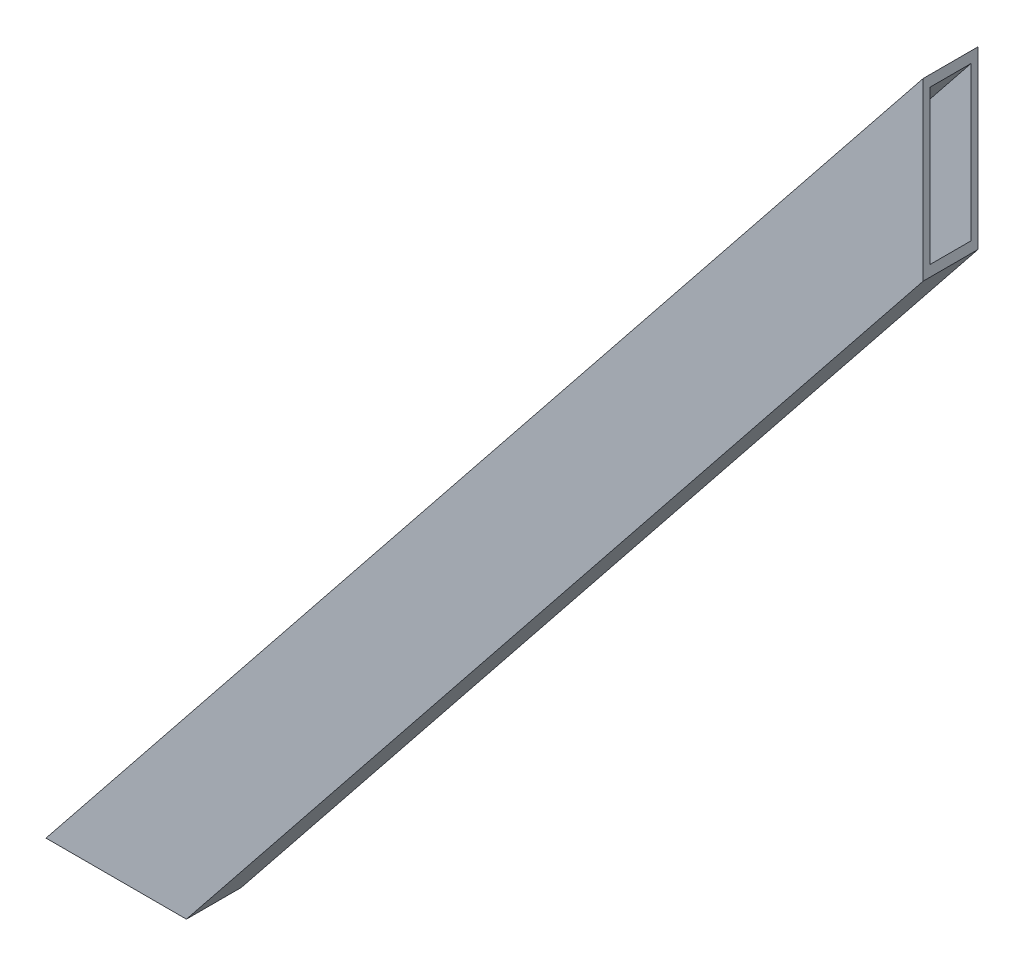
ISO-10303-21;
HEADER;
FILE_DESCRIPTION(('STEP AP214'),'2;1');
FILE_NAME('part.step','',(''),(''),'','','');
FILE_SCHEMA(('AUTOMOTIVE_DESIGN { 1 0 10303 214 1 1 1 1 }'));
ENDSEC;
DATA;
#1=APPLICATION_CONTEXT('core data for automotive mechanical design processes');
#2=APPLICATION_PROTOCOL_DEFINITION('international standard','automotive_design',2000,#1);
#3=PRODUCT_CONTEXT('',#1,'mechanical');
#4=PRODUCT('Part','Part','',(#3));
#5=PRODUCT_RELATED_PRODUCT_CATEGORY('part','',(#4));
#6=PRODUCT_DEFINITION_FORMATION('','',#4);
#7=PRODUCT_DEFINITION_CONTEXT('part definition',#1,'design');
#8=PRODUCT_DEFINITION('design','',#6,#7);
#9=PRODUCT_DEFINITION_SHAPE('','',#8);
#10=(LENGTH_UNIT() NAMED_UNIT(*) SI_UNIT(.MILLI.,.METRE.));
#11=(NAMED_UNIT(*) PLANE_ANGLE_UNIT() SI_UNIT($,.RADIAN.));
#12=(NAMED_UNIT(*) SI_UNIT($,.STERADIAN.) SOLID_ANGLE_UNIT());
#13=UNCERTAINTY_MEASURE_WITH_UNIT(LENGTH_MEASURE(1.E-05),#10,'distance_accuracy_value','');
#14=(GEOMETRIC_REPRESENTATION_CONTEXT(3) GLOBAL_UNCERTAINTY_ASSIGNED_CONTEXT((#13)) GLOBAL_UNIT_ASSIGNED_CONTEXT((#10,
#11,#12)) REPRESENTATION_CONTEXT('',''));
#15=CARTESIAN_POINT('',(0.,0.,0.));
#16=DIRECTION('',(0.,0.,1.));
#17=DIRECTION('',(1.,0.,0.));
#18=AXIS2_PLACEMENT_3D('',#15,#16,#17);
#19=CARTESIAN_POINT('',(65.0557422523179,0.,25.4));
#20=DIRECTION('',(0.,1.,0.));
#21=DIRECTION('',(-1.,0.,0.));
#22=AXIS2_PLACEMENT_3D('',#19,#20,#21);
#23=PLANE('',#22);
#24=DIRECTION('',(1.,0.,0.));
#25=VECTOR('',#24,1.);
#26=CARTESIAN_POINT('',(65.0557422523179,0.,0.));
#27=LINE('',#26,#25);
#28=CARTESIAN_POINT('',(0.,0.,0.));
#29=VERTEX_POINT('',#28);
#30=CARTESIAN_POINT('',(65.0557422523179,0.,0.));
#31=VERTEX_POINT('',#30);
#32=EDGE_CURVE('E184',#29,#31,#27,.T.);
#33=ORIENTED_EDGE('',*,*,#32,.T.);
#34=DIRECTION('',(0.,0.,-1.));
#35=VECTOR('',#34,1.);
#36=CARTESIAN_POINT('',(65.0557422523179,0.,25.4));
#37=LINE('',#36,#35);
#38=CARTESIAN_POINT('',(65.0557422523179,0.,25.4));
#39=VERTEX_POINT('',#38);
#40=EDGE_CURVE('E217',#39,#31,#37,.T.);
#41=ORIENTED_EDGE('',*,*,#40,.F.);
#42=DIRECTION('',(1.,0.,0.));
#43=VECTOR('',#42,1.);
#44=CARTESIAN_POINT('',(65.0557422523179,0.,25.4));
#45=LINE('',#44,#43);
#46=CARTESIAN_POINT('',(0.,0.,25.4));
#47=VERTEX_POINT('',#46);
#48=EDGE_CURVE('E191',#47,#39,#45,.T.);
#49=ORIENTED_EDGE('',*,*,#48,.F.);
#50=DIRECTION('',(0.,0.,-1.));
#51=VECTOR('',#50,1.);
#52=CARTESIAN_POINT('',(0.,0.,25.4));
#53=LINE('',#52,#51);
#54=EDGE_CURVE('E201',#47,#29,#53,.T.);
#55=ORIENTED_EDGE('',*,*,#54,.T.);
#56=EDGE_LOOP('',(#33,#41,#49,#55));
#57=FACE_BOUND('',#56,.T.);
#58=DIRECTION('',(1.,0.,0.));
#59=VECTOR('',#58,1.);
#60=CARTESIAN_POINT('',(65.0557422523179,0.,3.175));
#61=LINE('',#60,#59);
#62=CARTESIAN_POINT('',(4.06598389076986,0.,3.175));
#63=VERTEX_POINT('',#62);
#64=CARTESIAN_POINT('',(60.989758361548,0.,3.175));
#65=VERTEX_POINT('',#64);
#66=EDGE_CURVE('E156',#63,#65,#61,.T.);
#67=ORIENTED_EDGE('',*,*,#66,.F.);
#68=DIRECTION('',(0.,0.,-1.));
#69=VECTOR('',#68,1.);
#70=CARTESIAN_POINT('',(4.06598389076986,0.,25.4));
#71=LINE('',#70,#69);
#72=CARTESIAN_POINT('',(4.06598389076986,0.,22.225));
#73=VERTEX_POINT('',#72);
#74=EDGE_CURVE('E179',#73,#63,#71,.T.);
#75=ORIENTED_EDGE('',*,*,#74,.F.);
#76=DIRECTION('',(1.,0.,0.));
#77=VECTOR('',#76,1.);
#78=CARTESIAN_POINT('',(65.0557422523179,0.,22.225));
#79=LINE('',#78,#77);
#80=CARTESIAN_POINT('',(60.989758361548,0.,22.225));
#81=VERTEX_POINT('',#80);
#82=EDGE_CURVE('E175',#73,#81,#79,.T.);
#83=ORIENTED_EDGE('',*,*,#82,.T.);
#84=DIRECTION('',(0.,0.,-1.));
#85=VECTOR('',#84,1.);
#86=CARTESIAN_POINT('',(60.989758361548,0.,25.4));
#87=LINE('',#86,#85);
#88=EDGE_CURVE('E168',#81,#65,#87,.T.);
#89=ORIENTED_EDGE('',*,*,#88,.T.);
#90=EDGE_LOOP('',(#67,#75,#83,#89));
#91=FACE_BOUND('',#90,.T.);
#92=ADVANCED_FACE('F37',(#57,#91),#23,.F.);
#93=CARTESIAN_POINT('',(406.4,508.,25.4));
#94=DIRECTION('',(-1.,0.,0.));
#95=DIRECTION('',(0.,0.,1.));
#96=AXIS2_PLACEMENT_3D('',#93,#94,#95);
#97=PLANE('',#96);
#98=DIRECTION('',(0.,1.,0.));
#99=VECTOR('',#98,1.);
#100=CARTESIAN_POINT('',(406.4,508.,0.));
#101=LINE('',#100,#99);
#102=CARTESIAN_POINT('',(406.4,426.680322184603,0.));
#103=VERTEX_POINT('',#102);
#104=CARTESIAN_POINT('',(406.4,508.,0.));
#105=VERTEX_POINT('',#104);
#106=EDGE_CURVE('E206',#103,#105,#101,.T.);
#107=ORIENTED_EDGE('',*,*,#106,.T.);
#108=DIRECTION('',(0.,0.,-1.));
#109=VECTOR('',#108,1.);
#110=CARTESIAN_POINT('',(406.4,508.,25.4));
#111=LINE('',#110,#109);
#112=CARTESIAN_POINT('',(406.4,508.,25.4));
#113=VERTEX_POINT('',#112);
#114=EDGE_CURVE('E211',#113,#105,#111,.T.);
#115=ORIENTED_EDGE('',*,*,#114,.F.);
#116=DIRECTION('',(0.,1.,0.));
#117=VECTOR('',#116,1.);
#118=CARTESIAN_POINT('',(406.4,508.,25.4));
#119=LINE('',#118,#117);
#120=CARTESIAN_POINT('',(406.4,426.680322184603,25.4));
#121=VERTEX_POINT('',#120);
#122=EDGE_CURVE('E197',#121,#113,#119,.T.);
#123=ORIENTED_EDGE('',*,*,#122,.F.);
#124=DIRECTION('',(0.,0.,-1.));
#125=VECTOR('',#124,1.);
#126=CARTESIAN_POINT('',(406.4,426.680322184603,25.4));
#127=LINE('',#126,#125);
#128=EDGE_CURVE('E214',#121,#103,#127,.T.);
#129=ORIENTED_EDGE('',*,*,#128,.T.);
#130=EDGE_LOOP('',(#107,#115,#123,#129));
#131=FACE_BOUND('',#130,.T.);
#132=DIRECTION('',(0.,1.,0.));
#133=VECTOR('',#132,1.);
#134=CARTESIAN_POINT('',(406.4,508.,3.175));
#135=LINE('',#134,#133);
#136=CARTESIAN_POINT('',(406.4,431.762802048065,3.175));
#137=VERTEX_POINT('',#136);
#138=CARTESIAN_POINT('',(406.4,502.917520136538,3.175));
#139=VERTEX_POINT('',#138);
#140=EDGE_CURVE('E153',#137,#139,#135,.T.);
#141=ORIENTED_EDGE('',*,*,#140,.F.);
#142=DIRECTION('',(0.,0.,-1.));
#143=VECTOR('',#142,1.);
#144=CARTESIAN_POINT('',(406.4,431.762802048065,25.4));
#145=LINE('',#144,#143);
#146=CARTESIAN_POINT('',(406.4,431.762802048065,22.225));
#147=VERTEX_POINT('',#146);
#148=EDGE_CURVE('E163',#147,#137,#145,.T.);
#149=ORIENTED_EDGE('',*,*,#148,.F.);
#150=DIRECTION('',(0.,1.,0.));
#151=VECTOR('',#150,1.);
#152=CARTESIAN_POINT('',(406.4,508.,22.225));
#153=LINE('',#152,#151);
#154=CARTESIAN_POINT('',(406.4,502.917520136538,22.225));
#155=VERTEX_POINT('',#154);
#156=EDGE_CURVE('E180',#147,#155,#153,.T.);
#157=ORIENTED_EDGE('',*,*,#156,.T.);
#158=DIRECTION('',(0.,0.,-1.));
#159=VECTOR('',#158,1.);
#160=CARTESIAN_POINT('',(406.4,502.917520136538,25.4));
#161=LINE('',#160,#159);
#162=EDGE_CURVE('E169',#155,#139,#161,.T.);
#163=ORIENTED_EDGE('',*,*,#162,.T.);
#164=EDGE_LOOP('',(#141,#149,#157,#163));
#165=FACE_BOUND('',#164,.T.);
#166=ADVANCED_FACE('F172',(#131,#165),#97,.F.);
#167=CARTESIAN_POINT('',(406.4,426.680322184603,25.4));
#168=DIRECTION('',(-0.78086880944303,0.624695047554424,0.));
#169=DIRECTION('',(-0.624695047554424,-0.780868809443031,0.));
#170=AXIS2_PLACEMENT_3D('',#167,#168,#169);
#171=PLANE('',#170);
#172=DIRECTION('',(0.624695047554424,0.78086880944303,0.));
#173=VECTOR('',#172,1.);
#174=CARTESIAN_POINT('',(406.4,426.680322184603,0.));
#175=LINE('',#174,#173);
#176=EDGE_CURVE('E204',#31,#103,#175,.T.);
#177=ORIENTED_EDGE('',*,*,#176,.T.);
#178=ORIENTED_EDGE('',*,*,#128,.F.);
#179=DIRECTION('',(0.624695047554424,0.78086880944303,0.));
#180=VECTOR('',#179,1.);
#181=CARTESIAN_POINT('',(406.4,426.680322184603,25.4));
#182=LINE('',#181,#180);
#183=EDGE_CURVE('E194',#39,#121,#182,.T.);
#184=ORIENTED_EDGE('',*,*,#183,.F.);
#185=ORIENTED_EDGE('',*,*,#40,.T.);
#186=EDGE_LOOP('',(#177,#178,#184,#185));
#187=FACE_BOUND('',#186,.T.);
#188=ADVANCED_FACE('F356',(#187),#171,.F.);
#189=CARTESIAN_POINT('',(0.,0.,25.4));
#190=DIRECTION('',(0.78086880944303,-0.624695047554424,0.));
#191=DIRECTION('',(0.624695047554424,0.780868809443031,0.));
#192=AXIS2_PLACEMENT_3D('',#189,#190,#191);
#193=PLANE('',#192);
#194=DIRECTION('',(-0.624695047554424,-0.78086880944303,0.));
#195=VECTOR('',#194,1.);
#196=CARTESIAN_POINT('',(0.,0.,0.));
#197=LINE('',#196,#195);
#198=EDGE_CURVE('E195',#105,#29,#197,.T.);
#199=ORIENTED_EDGE('',*,*,#198,.T.);
#200=ORIENTED_EDGE('',*,*,#54,.F.);
#201=DIRECTION('',(-0.624695047554424,-0.78086880944303,0.));
#202=VECTOR('',#201,1.);
#203=CARTESIAN_POINT('',(0.,0.,25.4));
#204=LINE('',#203,#202);
#205=EDGE_CURVE('E199',#113,#47,#204,.T.);
#206=ORIENTED_EDGE('',*,*,#205,.F.);
#207=ORIENTED_EDGE('',*,*,#114,.T.);
#208=EDGE_LOOP('',(#199,#200,#206,#207));
#209=FACE_BOUND('',#208,.T.);
#210=ADVANCED_FACE('F414',(#209),#193,.F.);
#211=CARTESIAN_POINT('',(0.,0.,25.4));
#212=DIRECTION('',(0.,0.,1.));
#213=DIRECTION('',(1.,0.,0.));
#214=AXIS2_PLACEMENT_3D('',#211,#212,#213);
#215=PLANE('',#214);
#216=ORIENTED_EDGE('',*,*,#48,.T.);
#217=ORIENTED_EDGE('',*,*,#183,.T.);
#218=ORIENTED_EDGE('',*,*,#122,.T.);
#219=ORIENTED_EDGE('',*,*,#205,.T.);
#220=EDGE_LOOP('',(#216,#217,#218,#219));
#221=FACE_BOUND('',#220,.T.);
#222=ADVANCED_FACE('F408',(#221),#215,.T.);
#223=CARTESIAN_POINT('',(0.,0.,0.));
#224=DIRECTION('',(0.,0.,1.));
#225=DIRECTION('',(1.,0.,0.));
#226=AXIS2_PLACEMENT_3D('',#223,#224,#225);
#227=PLANE('',#226);
#228=CARTESIAN_POINT('',(296.519313009802,299.49442317378,0.));
#229=DIRECTION('',(0.,0.,1.));
#230=DIRECTION('',(1.,0.,0.));
#231=AXIS2_PLACEMENT_3D('',#228,#229,#230);
#232=CIRCLE('',#231,2.38125000000007);
#233=CARTESIAN_POINT('',(298.900563009802,299.49442317378,0.));
#234=VERTEX_POINT('',#233);
#235=EDGE_CURVE('E734',#234,#234,#232,.T.);
#236=ORIENTED_EDGE('',*,*,#235,.T.);
#237=EDGE_LOOP('',(#236));
#238=FACE_BOUND('',#237,.T.);
#239=CARTESIAN_POINT('',(344.121075633449,358.996626453339,0.));
#240=DIRECTION('',(0.,0.,1.));
#241=DIRECTION('',(1.,0.,0.));
#242=AXIS2_PLACEMENT_3D('',#239,#240,#241);
#243=CIRCLE('',#242,2.38125000000001);
#244=CARTESIAN_POINT('',(346.502325633449,358.996626453339,0.));
#245=VERTEX_POINT('',#244);
#246=EDGE_CURVE('E735',#245,#245,#243,.T.);
#247=ORIENTED_EDGE('',*,*,#246,.T.);
#248=EDGE_LOOP('',(#247));
#249=FACE_BOUND('',#248,.T.);
#250=CARTESIAN_POINT('',(98.1786354112725,51.5685761756177,0.));
#251=DIRECTION('',(0.,0.,1.));
#252=DIRECTION('',(-1.,0.,0.));
#253=AXIS2_PLACEMENT_3D('',#250,#251,#252);
#254=CIRCLE('',#253,2.38125);
#255=CARTESIAN_POINT('',(95.7973854112725,51.5685761756177,0.));
#256=VERTEX_POINT('',#255);
#257=EDGE_CURVE('E739',#256,#256,#254,.T.);
#258=ORIENTED_EDGE('',*,*,#257,.T.);
#259=EDGE_LOOP('',(#258));
#260=FACE_BOUND('',#259,.T.);
#261=CARTESIAN_POINT('',(145.78039803492,111.070779455177,0.));
#262=DIRECTION('',(0.,0.,1.));
#263=DIRECTION('',(-1.,0.,0.));
#264=AXIS2_PLACEMENT_3D('',#261,#262,#263);
#265=CIRCLE('',#264,2.38125);
#266=CARTESIAN_POINT('',(143.39914803492,111.070779455177,0.));
#267=VERTEX_POINT('',#266);
#268=EDGE_CURVE('E752',#267,#267,#265,.T.);
#269=ORIENTED_EDGE('',*,*,#268,.T.);
#270=EDGE_LOOP('',(#269));
#271=FACE_BOUND('',#270,.T.);
#272=CARTESIAN_POINT('',(193.382160658567,170.572982734736,0.));
#273=DIRECTION('',(0.,0.,1.));
#274=DIRECTION('',(-1.,0.,0.));
#275=AXIS2_PLACEMENT_3D('',#272,#273,#274);
#276=CIRCLE('',#275,2.38124999999995);
#277=CARTESIAN_POINT('',(191.000910658567,170.572982734736,0.));
#278=VERTEX_POINT('',#277);
#279=EDGE_CURVE('E326',#278,#278,#276,.T.);
#280=ORIENTED_EDGE('',*,*,#279,.T.);
#281=EDGE_LOOP('',(#280));
#282=FACE_BOUND('',#281,.T.);
#283=CARTESIAN_POINT('',(163.631059018787,194.373864046559,0.));
#284=DIRECTION('',(0.,0.,1.));
#285=DIRECTION('',(1.,0.,0.));
#286=AXIS2_PLACEMENT_3D('',#283,#284,#285);
#287=CIRCLE('',#286,2.38124999999998);
#288=CARTESIAN_POINT('',(166.012309018787,194.373864046559,0.));
#289=VERTEX_POINT('',#288);
#290=EDGE_CURVE('E747',#289,#289,#287,.T.);
#291=ORIENTED_EDGE('',*,*,#290,.T.);
#292=EDGE_LOOP('',(#291));
#293=FACE_BOUND('',#292,.T.);
#294=CARTESIAN_POINT('',(116.02929639514,134.871660767,0.));
#295=DIRECTION('',(0.,0.,1.));
#296=DIRECTION('',(1.,0.,0.));
#297=AXIS2_PLACEMENT_3D('',#294,#295,#296);
#298=CIRCLE('',#297,2.38125);
#299=CARTESIAN_POINT('',(118.41054639514,134.871660767,0.));
#300=VERTEX_POINT('',#299);
#301=EDGE_CURVE('E323',#300,#300,#298,.T.);
#302=ORIENTED_EDGE('',*,*,#301,.T.);
#303=EDGE_LOOP('',(#302));
#304=FACE_BOUND('',#303,.T.);
#305=CARTESIAN_POINT('',(68.4275337714929,75.3694574874414,0.));
#306=DIRECTION('',(0.,0.,1.));
#307=DIRECTION('',(1.,0.,0.));
#308=AXIS2_PLACEMENT_3D('',#305,#306,#307);
#309=CIRCLE('',#308,2.38125);
#310=CARTESIAN_POINT('',(70.8087837714929,75.3694574874414,0.));
#311=VERTEX_POINT('',#310);
#312=EDGE_CURVE('E317',#311,#311,#309,.T.);
#313=ORIENTED_EDGE('',*,*,#312,.T.);
#314=EDGE_LOOP('',(#313));
#315=FACE_BOUND('',#314,.T.);
#316=CARTESIAN_POINT('',(248.917550386155,239.992219894221,0.));
#317=DIRECTION('',(0.,0.,1.));
#318=DIRECTION('',(1.,0.,0.));
#319=AXIS2_PLACEMENT_3D('',#316,#317,#318);
#320=CIRCLE('',#319,2.38124999999986);
#321=CARTESIAN_POINT('',(251.298800386155,239.992219894221,0.));
#322=VERTEX_POINT('',#321);
#323=EDGE_CURVE('E736',#322,#322,#320,.T.);
#324=ORIENTED_EDGE('',*,*,#323,.T.);
#325=EDGE_LOOP('',(#324));
#326=FACE_BOUND('',#325,.T.);
#327=CARTESIAN_POINT('',(219.166448746375,263.793101206044,0.));
#328=DIRECTION('',(0.,0.,1.));
#329=DIRECTION('',(-1.,0.,0.));
#330=AXIS2_PLACEMENT_3D('',#327,#328,#329);
#331=CIRCLE('',#330,2.38124999999994);
#332=CARTESIAN_POINT('',(216.785198746375,263.793101206044,0.));
#333=VERTEX_POINT('',#332);
#334=EDGE_CURVE('E742',#333,#333,#331,.T.);
#335=ORIENTED_EDGE('',*,*,#334,.T.);
#336=EDGE_LOOP('',(#335));
#337=FACE_BOUND('',#336,.T.);
#338=CARTESIAN_POINT('',(266.768211370022,323.295304485603,0.));
#339=DIRECTION('',(0.,0.,1.));
#340=DIRECTION('',(-1.,0.,0.));
#341=AXIS2_PLACEMENT_3D('',#338,#339,#340);
#342=CIRCLE('',#341,2.38125000000001);
#343=CARTESIAN_POINT('',(264.386961370022,323.295304485603,0.));
#344=VERTEX_POINT('',#343);
#345=EDGE_CURVE('E770',#344,#344,#342,.T.);
#346=ORIENTED_EDGE('',*,*,#345,.T.);
#347=EDGE_LOOP('',(#346));
#348=FACE_BOUND('',#347,.T.);
#349=CARTESIAN_POINT('',(314.369973993669,382.797507765162,0.));
#350=DIRECTION('',(0.,0.,1.));
#351=DIRECTION('',(-1.,0.,0.));
#352=AXIS2_PLACEMENT_3D('',#349,#350,#351);
#353=CIRCLE('',#352,2.38125000000001);
#354=CARTESIAN_POINT('',(311.988723993669,382.797507765162,0.));
#355=VERTEX_POINT('',#354);
#356=EDGE_CURVE('E767',#355,#355,#353,.T.);
#357=ORIENTED_EDGE('',*,*,#356,.T.);
#358=EDGE_LOOP('',(#357));
#359=FACE_BOUND('',#358,.T.);
#360=CARTESIAN_POINT('',(191.398753882581,229.083482626302,0.));
#361=DIRECTION('',(0.,0.,1.));
#362=DIRECTION('',(1.,0.,0.));
#363=AXIS2_PLACEMENT_3D('',#360,#361,#362);
#364=CIRCLE('',#363,2.38125);
#365=CARTESIAN_POINT('',(193.780003882581,229.083482626302,0.));
#366=VERTEX_POINT('',#365);
#367=EDGE_CURVE('E764',#366,#366,#364,.T.);
#368=ORIENTED_EDGE('',*,*,#367,.T.);
#369=EDGE_LOOP('',(#368));
#370=FACE_BOUND('',#369,.T.);
#371=CARTESIAN_POINT('',(221.149855522361,205.282601314478,0.));
#372=DIRECTION('',(0.,0.,1.));
#373=DIRECTION('',(1.,0.,0.));
#374=AXIS2_PLACEMENT_3D('',#371,#372,#373);
#375=CIRCLE('',#374,2.38125);
#376=CARTESIAN_POINT('',(223.531105522361,205.282601314478,0.));
#377=VERTEX_POINT('',#376);
#378=EDGE_CURVE('E761',#377,#377,#375,.T.);
#379=ORIENTED_EDGE('',*,*,#378,.T.);
#380=EDGE_LOOP('',(#379));
#381=FACE_BOUND('',#380,.T.);
#382=DIRECTION('',(-0.780868809443031,0.624695047554424,0.));
#383=VECTOR('',#382,1.);
#384=CARTESIAN_POINT('',(344.616927327445,366.731912879681,0.));
#385=LINE('',#384,#383);
#386=CARTESIAN_POINT('',(342.137668857464,368.715319655667,0.));
#387=VERTEX_POINT('',#386);
#388=CARTESIAN_POINT('',(324.287007873596,382.995848442761,0.));
#389=VERTEX_POINT('',#388);
#390=EDGE_CURVE('E320',#387,#389,#385,.T.);
#391=ORIENTED_EDGE('',*,*,#390,.T.);
#392=CARTESIAN_POINT('',(322.303601097611,380.516589972779,0.));
#393=DIRECTION('',(0.,0.,1.));
#394=DIRECTION('',(1.,0.,0.));
#395=AXIS2_PLACEMENT_3D('',#392,#393,#394);
#396=CIRCLE('',#395,3.175);
#397=CARTESIAN_POINT('',(319.824342627629,382.499996748765,0.));
#398=VERTEX_POINT('',#397);
#399=EDGE_CURVE('E294',#389,#398,#396,.T.);
#400=ORIENTED_EDGE('',*,*,#399,.T.);
#401=DIRECTION('',(-0.624695047554424,-0.780868809443031,0.));
#402=VECTOR('',#401,1.);
#403=CARTESIAN_POINT('',(67.9316820774965,67.6341710610986,0.));
#404=LINE('',#403,#402);
#405=CARTESIAN_POINT('',(69.9150888534818,70.1134295310802,0.));
#406=VERTEX_POINT('',#405);
#407=EDGE_CURVE('E236',#398,#406,#404,.T.);
#408=ORIENTED_EDGE('',*,*,#407,.T.);
#409=CARTESIAN_POINT('',(72.3943473234634,68.1300227550949,0.));
#410=DIRECTION('',(0.,0.,1.));
#411=DIRECTION('',(1.,0.,0.));
#412=AXIS2_PLACEMENT_3D('',#409,#410,#411);
#413=CIRCLE('',#412,3.175);
#414=CARTESIAN_POINT('',(70.4109405474781,65.6507642851133,0.));
#415=VERTEX_POINT('',#414);
#416=EDGE_CURVE('E11',#406,#415,#413,.T.);
#417=ORIENTED_EDGE('',*,*,#416,.T.);
#418=DIRECTION('',(0.78086880944303,-0.624695047554425,0.));
#419=VECTOR('',#418,1.);
#420=CARTESIAN_POINT('',(90.7408600013274,49.3868287220339,0.));
#421=LINE('',#420,#419);
#422=CARTESIAN_POINT('',(88.2616015313457,51.3702354980192,0.));
#423=VERTEX_POINT('',#422);
#424=EDGE_CURVE('E314',#415,#423,#421,.T.);
#425=ORIENTED_EDGE('',*,*,#424,.T.);
#426=CARTESIAN_POINT('',(90.245008307331,53.8494939680008,0.));
#427=DIRECTION('',(0.,0.,1.));
#428=DIRECTION('',(1.,0.,0.));
#429=AXIS2_PLACEMENT_3D('',#426,#427,#428);
#430=CIRCLE('',#429,3.175);
#431=CARTESIAN_POINT('',(92.7242667773127,51.8660871920155,0.));
#432=VERTEX_POINT('',#431);
#433=EDGE_CURVE('E302',#423,#432,#430,.T.);
#434=ORIENTED_EDGE('',*,*,#433,.T.);
#435=DIRECTION('',(0.624695047554424,0.780868809443031,0.));
#436=VECTOR('',#435,1.);
#437=CARTESIAN_POINT('',(90.7408600013274,49.3868287220339,0.));
#438=LINE('',#437,#436);
#439=CARTESIAN_POINT('',(342.63352055146,364.2526544097,0.));
#440=VERTEX_POINT('',#439);
#441=EDGE_CURVE('E316',#432,#440,#438,.T.);
#442=ORIENTED_EDGE('',*,*,#441,.T.);
#443=CARTESIAN_POINT('',(340.154262081478,366.236061185685,0.));
#444=DIRECTION('',(0.,0.,1.));
#445=DIRECTION('',(1.,0.,0.));
#446=AXIS2_PLACEMENT_3D('',#443,#444,#445);
#447=CIRCLE('',#446,3.175);
#448=EDGE_CURVE('E298',#440,#387,#447,.T.);
#449=ORIENTED_EDGE('',*,*,#448,.T.);
#450=EDGE_LOOP('',(#391,#400,#408,#417,#425,#434,#442,#449));
#451=FACE_BOUND('',#450,.T.);
#452=ORIENTED_EDGE('',*,*,#32,.F.);
#453=ORIENTED_EDGE('',*,*,#198,.F.);
#454=ORIENTED_EDGE('',*,*,#106,.F.);
#455=ORIENTED_EDGE('',*,*,#176,.F.);
#456=EDGE_LOOP('',(#452,#453,#454,#455));
#457=FACE_BOUND('',#456,.T.);
#458=ADVANCED_FACE('F377',(#238,#249,#260,#271,#282,#293,#304,#315,#326,#337,#348,#359,#370,
#381,#451,#457),#227,.F.);
#459=CARTESIAN_POINT('',(403.920741530018,428.663728960588,25.4));
#460=DIRECTION('',(-0.78086880944303,0.624695047554424,0.));
#461=DIRECTION('',(-0.624695047554424,-0.780868809443031,0.));
#462=AXIS2_PLACEMENT_3D('',#459,#460,#461);
#463=PLANE('',#462);
#464=DIRECTION('',(0.624695047554424,0.780868809443031,0.));
#465=VECTOR('',#464,1.);
#466=CARTESIAN_POINT('',(403.920741530018,428.663728960588,3.175));
#467=LINE('',#466,#465);
#468=EDGE_CURVE('E149',#65,#137,#467,.T.);
#469=ORIENTED_EDGE('',*,*,#468,.F.);
#470=ORIENTED_EDGE('',*,*,#88,.F.);
#471=DIRECTION('',(0.624695047554424,0.780868809443031,0.));
#472=VECTOR('',#471,1.);
#473=CARTESIAN_POINT('',(403.920741530018,428.663728960588,22.225));
#474=LINE('',#473,#472);
#475=EDGE_CURVE('E165',#81,#147,#474,.T.);
#476=ORIENTED_EDGE('',*,*,#475,.T.);
#477=ORIENTED_EDGE('',*,*,#148,.T.);
#478=EDGE_LOOP('',(#469,#470,#476,#477));
#479=FACE_BOUND('',#478,.T.);
#480=ADVANCED_FACE('F164',(#479),#463,.T.);
#481=CARTESIAN_POINT('',(2.47925846998162,-1.9834067759853,25.4));
#482=DIRECTION('',(0.78086880944303,-0.624695047554424,0.));
#483=DIRECTION('',(0.624695047554424,0.780868809443031,0.));
#484=AXIS2_PLACEMENT_3D('',#481,#482,#483);
#485=PLANE('',#484);
#486=DIRECTION('',(-0.624695047554424,-0.780868809443031,0.));
#487=VECTOR('',#486,1.);
#488=CARTESIAN_POINT('',(2.47925846998162,-1.9834067759853,3.175));
#489=LINE('',#488,#487);
#490=EDGE_CURVE('E173',#139,#63,#489,.T.);
#491=ORIENTED_EDGE('',*,*,#490,.F.);
#492=ORIENTED_EDGE('',*,*,#162,.F.);
#493=DIRECTION('',(-0.624695047554424,-0.780868809443031,0.));
#494=VECTOR('',#493,1.);
#495=CARTESIAN_POINT('',(2.47925846998162,-1.9834067759853,22.225));
#496=LINE('',#495,#494);
#497=EDGE_CURVE('E182',#155,#73,#496,.T.);
#498=ORIENTED_EDGE('',*,*,#497,.T.);
#499=ORIENTED_EDGE('',*,*,#74,.T.);
#500=EDGE_LOOP('',(#491,#492,#498,#499));
#501=FACE_BOUND('',#500,.T.);
#502=ADVANCED_FACE('F337',(#501),#485,.T.);
#503=CARTESIAN_POINT('',(0.,0.,22.225));
#504=DIRECTION('',(0.,0.,1.));
#505=DIRECTION('',(1.,0.,0.));
#506=AXIS2_PLACEMENT_3D('',#503,#504,#505);
#507=PLANE('',#506);
#508=ORIENTED_EDGE('',*,*,#82,.F.);
#509=ORIENTED_EDGE('',*,*,#497,.F.);
#510=ORIENTED_EDGE('',*,*,#156,.F.);
#511=ORIENTED_EDGE('',*,*,#475,.F.);
#512=EDGE_LOOP('',(#508,#509,#510,#511));
#513=FACE_BOUND('',#512,.T.);
#514=ADVANCED_FACE('F340',(#513),#507,.F.);
#515=CARTESIAN_POINT('',(0.,0.,3.175));
#516=DIRECTION('',(0.,0.,1.));
#517=DIRECTION('',(1.,0.,0.));
#518=AXIS2_PLACEMENT_3D('',#515,#516,#517);
#519=PLANE('',#518);
#520=CARTESIAN_POINT('',(296.519313009802,299.49442317378,3.175));
#521=DIRECTION('',(0.,0.,1.));
#522=DIRECTION('',(1.,0.,0.));
#523=AXIS2_PLACEMENT_3D('',#520,#521,#522);
#524=CIRCLE('',#523,2.38125000000007);
#525=CARTESIAN_POINT('',(298.900563009802,299.49442317378,3.175));
#526=VERTEX_POINT('',#525);
#527=EDGE_CURVE('E190',#526,#526,#524,.T.);
#528=ORIENTED_EDGE('',*,*,#527,.F.);
#529=EDGE_LOOP('',(#528));
#530=FACE_BOUND('',#529,.T.);
#531=CARTESIAN_POINT('',(344.121075633449,358.996626453339,3.175));
#532=DIRECTION('',(0.,0.,1.));
#533=DIRECTION('',(1.,0.,0.));
#534=AXIS2_PLACEMENT_3D('',#531,#532,#533);
#535=CIRCLE('',#534,2.38125000000001);
#536=CARTESIAN_POINT('',(346.502325633449,358.996626453339,3.175));
#537=VERTEX_POINT('',#536);
#538=EDGE_CURVE('E269',#537,#537,#535,.T.);
#539=ORIENTED_EDGE('',*,*,#538,.F.);
#540=EDGE_LOOP('',(#539));
#541=FACE_BOUND('',#540,.T.);
#542=CARTESIAN_POINT('',(98.1786354112725,51.5685761756177,3.175));
#543=DIRECTION('',(0.,0.,1.));
#544=DIRECTION('',(1.,0.,0.));
#545=AXIS2_PLACEMENT_3D('',#542,#543,#544);
#546=CIRCLE('',#545,2.38125);
#547=CARTESIAN_POINT('',(100.559885411272,51.5685761756177,3.175));
#548=VERTEX_POINT('',#547);
#549=EDGE_CURVE('E266',#548,#548,#546,.T.);
#550=ORIENTED_EDGE('',*,*,#549,.F.);
#551=EDGE_LOOP('',(#550));
#552=FACE_BOUND('',#551,.T.);
#553=CARTESIAN_POINT('',(145.78039803492,111.070779455177,3.175));
#554=DIRECTION('',(0.,0.,1.));
#555=DIRECTION('',(1.,0.,0.));
#556=AXIS2_PLACEMENT_3D('',#553,#554,#555);
#557=CIRCLE('',#556,2.38125);
#558=CARTESIAN_POINT('',(148.16164803492,111.070779455177,3.175));
#559=VERTEX_POINT('',#558);
#560=EDGE_CURVE('E263',#559,#559,#557,.T.);
#561=ORIENTED_EDGE('',*,*,#560,.F.);
#562=EDGE_LOOP('',(#561));
#563=FACE_BOUND('',#562,.T.);
#564=CARTESIAN_POINT('',(193.382160658567,170.572982734736,3.175));
#565=DIRECTION('',(0.,0.,1.));
#566=DIRECTION('',(1.,0.,0.));
#567=AXIS2_PLACEMENT_3D('',#564,#565,#566);
#568=CIRCLE('',#567,2.38124999999995);
#569=CARTESIAN_POINT('',(195.763410658567,170.572982734736,3.175));
#570=VERTEX_POINT('',#569);
#571=EDGE_CURVE('E260',#570,#570,#568,.T.);
#572=ORIENTED_EDGE('',*,*,#571,.F.);
#573=EDGE_LOOP('',(#572));
#574=FACE_BOUND('',#573,.T.);
#575=CARTESIAN_POINT('',(163.631059018787,194.373864046559,3.175));
#576=DIRECTION('',(0.,0.,1.));
#577=DIRECTION('',(1.,0.,0.));
#578=AXIS2_PLACEMENT_3D('',#575,#576,#577);
#579=CIRCLE('',#578,2.38124999999998);
#580=CARTESIAN_POINT('',(166.012309018787,194.373864046559,3.175));
#581=VERTEX_POINT('',#580);
#582=EDGE_CURVE('E257',#581,#581,#579,.T.);
#583=ORIENTED_EDGE('',*,*,#582,.F.);
#584=EDGE_LOOP('',(#583));
#585=FACE_BOUND('',#584,.T.);
#586=CARTESIAN_POINT('',(116.02929639514,134.871660767,3.175));
#587=DIRECTION('',(0.,0.,1.));
#588=DIRECTION('',(1.,0.,0.));
#589=AXIS2_PLACEMENT_3D('',#586,#587,#588);
#590=CIRCLE('',#589,2.38125);
#591=CARTESIAN_POINT('',(118.41054639514,134.871660767,3.175));
#592=VERTEX_POINT('',#591);
#593=EDGE_CURVE('E254',#592,#592,#590,.T.);
#594=ORIENTED_EDGE('',*,*,#593,.F.);
#595=EDGE_LOOP('',(#594));
#596=FACE_BOUND('',#595,.T.);
#597=CARTESIAN_POINT('',(68.4275337714929,75.3694574874414,3.175));
#598=DIRECTION('',(0.,0.,1.));
#599=DIRECTION('',(1.,0.,0.));
#600=AXIS2_PLACEMENT_3D('',#597,#598,#599);
#601=CIRCLE('',#600,2.38125);
#602=CARTESIAN_POINT('',(70.8087837714929,75.3694574874414,3.175));
#603=VERTEX_POINT('',#602);
#604=EDGE_CURVE('E251',#603,#603,#601,.T.);
#605=ORIENTED_EDGE('',*,*,#604,.F.);
#606=EDGE_LOOP('',(#605));
#607=FACE_BOUND('',#606,.T.);
#608=CARTESIAN_POINT('',(248.917550386155,239.992219894221,3.175));
#609=DIRECTION('',(0.,0.,1.));
#610=DIRECTION('',(1.,0.,0.));
#611=AXIS2_PLACEMENT_3D('',#608,#609,#610);
#612=CIRCLE('',#611,2.38124999999986);
#613=CARTESIAN_POINT('',(251.298800386155,239.992219894221,3.175));
#614=VERTEX_POINT('',#613);
#615=EDGE_CURVE('E248',#614,#614,#612,.T.);
#616=ORIENTED_EDGE('',*,*,#615,.F.);
#617=EDGE_LOOP('',(#616));
#618=FACE_BOUND('',#617,.T.);
#619=CARTESIAN_POINT('',(219.166448746375,263.793101206044,3.175));
#620=DIRECTION('',(0.,0.,1.));
#621=DIRECTION('',(1.,0.,0.));
#622=AXIS2_PLACEMENT_3D('',#619,#620,#621);
#623=CIRCLE('',#622,2.38124999999994);
#624=CARTESIAN_POINT('',(221.547698746375,263.793101206044,3.175));
#625=VERTEX_POINT('',#624);
#626=EDGE_CURVE('E245',#625,#625,#623,.T.);
#627=ORIENTED_EDGE('',*,*,#626,.F.);
#628=EDGE_LOOP('',(#627));
#629=FACE_BOUND('',#628,.T.);
#630=CARTESIAN_POINT('',(266.768211370022,323.295304485603,3.175));
#631=DIRECTION('',(0.,0.,1.));
#632=DIRECTION('',(1.,0.,0.));
#633=AXIS2_PLACEMENT_3D('',#630,#631,#632);
#634=CIRCLE('',#633,2.38125000000001);
#635=CARTESIAN_POINT('',(269.149461370022,323.295304485603,3.175));
#636=VERTEX_POINT('',#635);
#637=EDGE_CURVE('E242',#636,#636,#634,.T.);
#638=ORIENTED_EDGE('',*,*,#637,.F.);
#639=EDGE_LOOP('',(#638));
#640=FACE_BOUND('',#639,.T.);
#641=CARTESIAN_POINT('',(314.369973993669,382.797507765162,3.175));
#642=DIRECTION('',(0.,0.,1.));
#643=DIRECTION('',(1.,0.,0.));
#644=AXIS2_PLACEMENT_3D('',#641,#642,#643);
#645=CIRCLE('',#644,2.38125000000001);
#646=CARTESIAN_POINT('',(316.751223993669,382.797507765162,3.175));
#647=VERTEX_POINT('',#646);
#648=EDGE_CURVE('E239',#647,#647,#645,.T.);
#649=ORIENTED_EDGE('',*,*,#648,.F.);
#650=EDGE_LOOP('',(#649));
#651=FACE_BOUND('',#650,.T.);
#652=CARTESIAN_POINT('',(191.398753882581,229.083482626302,3.175));
#653=DIRECTION('',(0.,0.,1.));
#654=DIRECTION('',(1.,0.,0.));
#655=AXIS2_PLACEMENT_3D('',#652,#653,#654);
#656=CIRCLE('',#655,2.38125);
#657=CARTESIAN_POINT('',(193.780003882581,229.083482626302,3.175));
#658=VERTEX_POINT('',#657);
#659=EDGE_CURVE('E235',#658,#658,#656,.T.);
#660=ORIENTED_EDGE('',*,*,#659,.F.);
#661=EDGE_LOOP('',(#660));
#662=FACE_BOUND('',#661,.T.);
#663=CARTESIAN_POINT('',(221.149855522361,205.282601314478,3.175));
#664=DIRECTION('',(0.,0.,1.));
#665=DIRECTION('',(1.,0.,0.));
#666=AXIS2_PLACEMENT_3D('',#663,#664,#665);
#667=CIRCLE('',#666,2.38125);
#668=CARTESIAN_POINT('',(223.531105522361,205.282601314478,3.175));
#669=VERTEX_POINT('',#668);
#670=EDGE_CURVE('E232',#669,#669,#667,.T.);
#671=ORIENTED_EDGE('',*,*,#670,.F.);
#672=EDGE_LOOP('',(#671));
#673=FACE_BOUND('',#672,.T.);
#674=DIRECTION('',(0.78086880944303,-0.624695047554425,0.));
#675=VECTOR('',#674,1.);
#676=CARTESIAN_POINT('',(59.502203279559,74.3777540994487,3.175));
#677=LINE('',#676,#675);
#678=CARTESIAN_POINT('',(70.4109405474781,65.6507642851133,3.175));
#679=VERTEX_POINT('',#678);
#680=CARTESIAN_POINT('',(88.2616015313458,51.3702354980192,3.175));
#681=VERTEX_POINT('',#680);
#682=EDGE_CURVE('E229',#679,#681,#677,.T.);
#683=ORIENTED_EDGE('',*,*,#682,.F.);
#684=CARTESIAN_POINT('',(72.3943473234634,68.1300227550949,3.175));
#685=DIRECTION('',(0.,0.,1.));
#686=DIRECTION('',(1.,0.,0.));
#687=AXIS2_PLACEMENT_3D('',#684,#685,#686);
#688=CIRCLE('',#687,3.175);
#689=CARTESIAN_POINT('',(69.9150888534818,70.1134295310802,3.175));
#690=VERTEX_POINT('',#689);
#691=EDGE_CURVE('E45',#679,#690,#688,.F.);
#692=ORIENTED_EDGE('',*,*,#691,.T.);
#693=DIRECTION('',(-0.624695047554424,-0.780868809443031,0.));
#694=VECTOR('',#693,1.);
#695=CARTESIAN_POINT('',(8.42947879793763,-6.7435830383501,3.175));
#696=LINE('',#695,#694);
#697=CARTESIAN_POINT('',(319.824342627629,382.499996748765,3.175));
#698=VERTEX_POINT('',#697);
#699=EDGE_CURVE('E226',#698,#690,#696,.T.);
#700=ORIENTED_EDGE('',*,*,#699,.F.);
#701=CARTESIAN_POINT('',(322.303601097611,380.516589972779,3.175));
#702=DIRECTION('',(0.,0.,1.));
#703=DIRECTION('',(1.,0.,0.));
#704=AXIS2_PLACEMENT_3D('',#701,#702,#703);
#705=CIRCLE('',#704,3.175);
#706=CARTESIAN_POINT('',(324.287007873596,382.995848442761,3.175));
#707=VERTEX_POINT('',#706);
#708=EDGE_CURVE('E292',#698,#707,#705,.F.);
#709=ORIENTED_EDGE('',*,*,#708,.T.);
#710=DIRECTION('',(-0.780868809443031,0.624695047554424,0.));
#711=VECTOR('',#710,1.);
#712=CARTESIAN_POINT('',(313.378270605677,391.722838257096,3.175));
#713=LINE('',#712,#711);
#714=CARTESIAN_POINT('',(342.137668857464,368.715319655667,3.175));
#715=VERTEX_POINT('',#714);
#716=EDGE_CURVE('E223',#715,#707,#713,.T.);
#717=ORIENTED_EDGE('',*,*,#716,.F.);
#718=CARTESIAN_POINT('',(340.154262081478,366.236061185685,3.175));
#719=DIRECTION('',(0.,0.,1.));
#720=DIRECTION('',(1.,0.,0.));
#721=AXIS2_PLACEMENT_3D('',#718,#719,#720);
#722=CIRCLE('',#721,3.175);
#723=CARTESIAN_POINT('',(342.63352055146,364.2526544097,3.175));
#724=VERTEX_POINT('',#723);
#725=EDGE_CURVE('E296',#715,#724,#722,.F.);
#726=ORIENTED_EDGE('',*,*,#725,.T.);
#727=DIRECTION('',(0.624695047554424,0.780868809443031,0.));
#728=VECTOR('',#727,1.);
#729=CARTESIAN_POINT('',(31.2386567217685,-24.9909253774148,3.175));
#730=LINE('',#729,#728);
#731=CARTESIAN_POINT('',(92.7242667773127,51.8660871920156,3.175));
#732=VERTEX_POINT('',#731);
#733=EDGE_CURVE('E220',#732,#724,#730,.T.);
#734=ORIENTED_EDGE('',*,*,#733,.F.);
#735=CARTESIAN_POINT('',(90.245008307331,53.8494939680008,3.175));
#736=DIRECTION('',(0.,0.,1.));
#737=DIRECTION('',(1.,0.,0.));
#738=AXIS2_PLACEMENT_3D('',#735,#736,#737);
#739=CIRCLE('',#738,3.175);
#740=EDGE_CURVE('E300',#732,#681,#739,.F.);
#741=ORIENTED_EDGE('',*,*,#740,.T.);
#742=EDGE_LOOP('',(#683,#692,#700,#709,#717,#726,#734,#741));
#743=FACE_BOUND('',#742,.T.);
#744=ORIENTED_EDGE('',*,*,#66,.T.);
#745=ORIENTED_EDGE('',*,*,#468,.T.);
#746=ORIENTED_EDGE('',*,*,#140,.T.);
#747=ORIENTED_EDGE('',*,*,#490,.T.);
#748=EDGE_LOOP('',(#744,#745,#746,#747));
#749=FACE_BOUND('',#748,.T.);
#750=ADVANCED_FACE('F151',(#530,#541,#552,#563,#574,#585,#596,#607,#618,#629,#640,#651,#662,
#673,#743,#749),#519,.T.);
#751=CARTESIAN_POINT('',(90.7408600013274,49.3868287220339,0.));
#752=DIRECTION('',(-0.624695047554425,-0.78086880944303,0.));
#753=DIRECTION('',(0.78086880944303,-0.624695047554425,0.));
#754=AXIS2_PLACEMENT_3D('',#751,#752,#753);
#755=PLANE('',#754);
#756=ORIENTED_EDGE('',*,*,#682,.T.);
#757=DIRECTION('',(0.,0.,1.));
#758=VECTOR('',#757,1.);
#759=CARTESIAN_POINT('',(88.2616015313457,51.3702354980192,0.));
#760=LINE('',#759,#758);
#761=EDGE_CURVE('E52',#681,#423,#760,.F.);
#762=ORIENTED_EDGE('',*,*,#761,.T.);
#763=ORIENTED_EDGE('',*,*,#424,.F.);
#764=DIRECTION('',(0.,0.,1.));
#765=VECTOR('',#764,1.);
#766=CARTESIAN_POINT('',(70.4109405474781,65.6507642851133,3.175));
#767=LINE('',#766,#765);
#768=EDGE_CURVE('E288',#415,#679,#767,.T.);
#769=ORIENTED_EDGE('',*,*,#768,.T.);
#770=EDGE_LOOP('',(#756,#762,#763,#769));
#771=FACE_BOUND('',#770,.T.);
#772=ADVANCED_FACE('F313',(#771),#755,.F.);
#773=CARTESIAN_POINT('',(67.9316820774965,67.6341710610986,0.));
#774=DIRECTION('',(-0.78086880944303,0.624695047554424,0.));
#775=DIRECTION('',(-0.624695047554424,-0.780868809443031,0.));
#776=AXIS2_PLACEMENT_3D('',#773,#774,#775);
#777=PLANE('',#776);
#778=ORIENTED_EDGE('',*,*,#407,.F.);
#779=DIRECTION('',(0.,0.,1.));
#780=VECTOR('',#779,1.);
#781=CARTESIAN_POINT('',(319.824342627629,382.499996748765,3.175));
#782=LINE('',#781,#780);
#783=EDGE_CURVE('E275',#398,#698,#782,.T.);
#784=ORIENTED_EDGE('',*,*,#783,.T.);
#785=ORIENTED_EDGE('',*,*,#699,.T.);
#786=DIRECTION('',(0.,0.,1.));
#787=VECTOR('',#786,1.);
#788=CARTESIAN_POINT('',(69.9150888534818,70.1134295310802,0.));
#789=LINE('',#788,#787);
#790=EDGE_CURVE('E231',#690,#406,#789,.F.);
#791=ORIENTED_EDGE('',*,*,#790,.T.);
#792=EDGE_LOOP('',(#778,#784,#785,#791));
#793=FACE_BOUND('',#792,.T.);
#794=ADVANCED_FACE('F311',(#793),#777,.F.);
#795=CARTESIAN_POINT('',(344.616927327445,366.731912879681,0.));
#796=DIRECTION('',(0.624695047554424,0.780868809443031,0.));
#797=DIRECTION('',(-0.780868809443031,0.624695047554424,0.));
#798=AXIS2_PLACEMENT_3D('',#795,#796,#797);
#799=PLANE('',#798);
#800=ORIENTED_EDGE('',*,*,#716,.T.);
#801=DIRECTION('',(0.,0.,1.));
#802=VECTOR('',#801,1.);
#803=CARTESIAN_POINT('',(324.287007873596,382.995848442761,0.));
#804=LINE('',#803,#802);
#805=EDGE_CURVE('E281',#707,#389,#804,.F.);
#806=ORIENTED_EDGE('',*,*,#805,.T.);
#807=ORIENTED_EDGE('',*,*,#390,.F.);
#808=DIRECTION('',(0.,0.,1.));
#809=VECTOR('',#808,1.);
#810=CARTESIAN_POINT('',(342.137668857464,368.715319655667,3.175));
#811=LINE('',#810,#809);
#812=EDGE_CURVE('E278',#387,#715,#811,.T.);
#813=ORIENTED_EDGE('',*,*,#812,.T.);
#814=EDGE_LOOP('',(#800,#806,#807,#813));
#815=FACE_BOUND('',#814,.T.);
#816=ADVANCED_FACE('F388',(#815),#799,.F.);
#817=CARTESIAN_POINT('',(90.7408600013274,49.3868287220339,0.));
#818=DIRECTION('',(0.780868809443031,-0.624695047554424,0.));
#819=DIRECTION('',(0.624695047554424,0.780868809443031,0.));
#820=AXIS2_PLACEMENT_3D('',#817,#818,#819);
#821=PLANE('',#820);
#822=ORIENTED_EDGE('',*,*,#733,.T.);
#823=DIRECTION('',(0.,0.,1.));
#824=VECTOR('',#823,1.);
#825=CARTESIAN_POINT('',(342.63352055146,364.2526544097,0.));
#826=LINE('',#825,#824);
#827=EDGE_CURVE('E286',#724,#440,#826,.F.);
#828=ORIENTED_EDGE('',*,*,#827,.T.);
#829=ORIENTED_EDGE('',*,*,#441,.F.);
#830=DIRECTION('',(0.,0.,1.));
#831=VECTOR('',#830,1.);
#832=CARTESIAN_POINT('',(92.7242667773127,51.8660871920155,3.175));
#833=LINE('',#832,#831);
#834=EDGE_CURVE('E283',#432,#732,#833,.T.);
#835=ORIENTED_EDGE('',*,*,#834,.T.);
#836=EDGE_LOOP('',(#822,#828,#829,#835));
#837=FACE_BOUND('',#836,.T.);
#838=ADVANCED_FACE('F381',(#837),#821,.F.);
#839=CARTESIAN_POINT('',(221.149855522361,205.282601314478,0.));
#840=DIRECTION('',(0.,0.,1.));
#841=DIRECTION('',(1.,0.,0.));
#842=AXIS2_PLACEMENT_3D('',#839,#840,#841);
#843=CYLINDRICAL_SURFACE('',#842,2.38125);
#844=ORIENTED_EDGE('',*,*,#670,.T.);
#845=EDGE_LOOP('',(#844));
#846=FACE_BOUND('',#845,.T.);
#847=ORIENTED_EDGE('',*,*,#378,.F.);
#848=EDGE_LOOP('',(#847));
#849=FACE_BOUND('',#848,.T.);
#850=ADVANCED_FACE('F397',(#846,#849),#843,.F.);
#851=CARTESIAN_POINT('',(191.398753882581,229.083482626302,0.));
#852=DIRECTION('',(0.,0.,1.));
#853=DIRECTION('',(1.,0.,0.));
#854=AXIS2_PLACEMENT_3D('',#851,#852,#853);
#855=CYLINDRICAL_SURFACE('',#854,2.38125);
#856=ORIENTED_EDGE('',*,*,#659,.T.);
#857=EDGE_LOOP('',(#856));
#858=FACE_BOUND('',#857,.T.);
#859=ORIENTED_EDGE('',*,*,#367,.F.);
#860=EDGE_LOOP('',(#859));
#861=FACE_BOUND('',#860,.T.);
#862=ADVANCED_FACE('F474',(#858,#861),#855,.F.);
#863=CARTESIAN_POINT('',(314.369973993669,382.797507765162,0.));
#864=DIRECTION('',(0.,0.,1.));
#865=DIRECTION('',(1.,0.,0.));
#866=AXIS2_PLACEMENT_3D('',#863,#864,#865);
#867=CYLINDRICAL_SURFACE('',#866,2.38125000000001);
#868=ORIENTED_EDGE('',*,*,#648,.T.);
#869=EDGE_LOOP('',(#868));
#870=FACE_BOUND('',#869,.T.);
#871=ORIENTED_EDGE('',*,*,#356,.F.);
#872=EDGE_LOOP('',(#871));
#873=FACE_BOUND('',#872,.T.);
#874=ADVANCED_FACE('F486',(#870,#873),#867,.F.);
#875=CARTESIAN_POINT('',(266.768211370022,323.295304485603,0.));
#876=DIRECTION('',(0.,0.,1.));
#877=DIRECTION('',(1.,0.,0.));
#878=AXIS2_PLACEMENT_3D('',#875,#876,#877);
#879=CYLINDRICAL_SURFACE('',#878,2.38125000000001);
#880=ORIENTED_EDGE('',*,*,#637,.T.);
#881=EDGE_LOOP('',(#880));
#882=FACE_BOUND('',#881,.T.);
#883=ORIENTED_EDGE('',*,*,#345,.F.);
#884=EDGE_LOOP('',(#883));
#885=FACE_BOUND('',#884,.T.);
#886=ADVANCED_FACE('F497',(#882,#885),#879,.F.);
#887=CARTESIAN_POINT('',(219.166448746375,263.793101206044,0.));
#888=DIRECTION('',(0.,0.,1.));
#889=DIRECTION('',(1.,0.,0.));
#890=AXIS2_PLACEMENT_3D('',#887,#888,#889);
#891=CYLINDRICAL_SURFACE('',#890,2.38124999999994);
#892=ORIENTED_EDGE('',*,*,#626,.T.);
#893=EDGE_LOOP('',(#892));
#894=FACE_BOUND('',#893,.T.);
#895=ORIENTED_EDGE('',*,*,#334,.F.);
#896=EDGE_LOOP('',(#895));
#897=FACE_BOUND('',#896,.T.);
#898=ADVANCED_FACE('F508',(#894,#897),#891,.F.);
#899=CARTESIAN_POINT('',(248.917550386155,239.992219894221,0.));
#900=DIRECTION('',(0.,0.,1.));
#901=DIRECTION('',(1.,0.,0.));
#902=AXIS2_PLACEMENT_3D('',#899,#900,#901);
#903=CYLINDRICAL_SURFACE('',#902,2.38124999999986);
#904=ORIENTED_EDGE('',*,*,#615,.T.);
#905=EDGE_LOOP('',(#904));
#906=FACE_BOUND('',#905,.T.);
#907=ORIENTED_EDGE('',*,*,#323,.F.);
#908=EDGE_LOOP('',(#907));
#909=FACE_BOUND('',#908,.T.);
#910=ADVANCED_FACE('F519',(#906,#909),#903,.F.);
#911=CARTESIAN_POINT('',(68.4275337714929,75.3694574874414,0.));
#912=DIRECTION('',(0.,0.,1.));
#913=DIRECTION('',(1.,0.,0.));
#914=AXIS2_PLACEMENT_3D('',#911,#912,#913);
#915=CYLINDRICAL_SURFACE('',#914,2.38125);
#916=ORIENTED_EDGE('',*,*,#604,.T.);
#917=EDGE_LOOP('',(#916));
#918=FACE_BOUND('',#917,.T.);
#919=ORIENTED_EDGE('',*,*,#312,.F.);
#920=EDGE_LOOP('',(#919));
#921=FACE_BOUND('',#920,.T.);
#922=ADVANCED_FACE('F530',(#918,#921),#915,.F.);
#923=CARTESIAN_POINT('',(116.02929639514,134.871660767,0.));
#924=DIRECTION('',(0.,0.,1.));
#925=DIRECTION('',(1.,0.,0.));
#926=AXIS2_PLACEMENT_3D('',#923,#924,#925);
#927=CYLINDRICAL_SURFACE('',#926,2.38125);
#928=ORIENTED_EDGE('',*,*,#593,.T.);
#929=EDGE_LOOP('',(#928));
#930=FACE_BOUND('',#929,.T.);
#931=ORIENTED_EDGE('',*,*,#301,.F.);
#932=EDGE_LOOP('',(#931));
#933=FACE_BOUND('',#932,.T.);
#934=ADVANCED_FACE('F541',(#930,#933),#927,.F.);
#935=CARTESIAN_POINT('',(163.631059018787,194.373864046559,0.));
#936=DIRECTION('',(0.,0.,1.));
#937=DIRECTION('',(1.,0.,0.));
#938=AXIS2_PLACEMENT_3D('',#935,#936,#937);
#939=CYLINDRICAL_SURFACE('',#938,2.38124999999998);
#940=ORIENTED_EDGE('',*,*,#582,.T.);
#941=EDGE_LOOP('',(#940));
#942=FACE_BOUND('',#941,.T.);
#943=ORIENTED_EDGE('',*,*,#290,.F.);
#944=EDGE_LOOP('',(#943));
#945=FACE_BOUND('',#944,.T.);
#946=ADVANCED_FACE('F552',(#942,#945),#939,.F.);
#947=CARTESIAN_POINT('',(193.382160658567,170.572982734736,0.));
#948=DIRECTION('',(0.,0.,1.));
#949=DIRECTION('',(1.,0.,0.));
#950=AXIS2_PLACEMENT_3D('',#947,#948,#949);
#951=CYLINDRICAL_SURFACE('',#950,2.38124999999995);
#952=ORIENTED_EDGE('',*,*,#571,.T.);
#953=EDGE_LOOP('',(#952));
#954=FACE_BOUND('',#953,.T.);
#955=ORIENTED_EDGE('',*,*,#279,.F.);
#956=EDGE_LOOP('',(#955));
#957=FACE_BOUND('',#956,.T.);
#958=ADVANCED_FACE('F563',(#954,#957),#951,.F.);
#959=CARTESIAN_POINT('',(145.78039803492,111.070779455177,0.));
#960=DIRECTION('',(0.,0.,1.));
#961=DIRECTION('',(1.,0.,0.));
#962=AXIS2_PLACEMENT_3D('',#959,#960,#961);
#963=CYLINDRICAL_SURFACE('',#962,2.38125);
#964=ORIENTED_EDGE('',*,*,#560,.T.);
#965=EDGE_LOOP('',(#964));
#966=FACE_BOUND('',#965,.T.);
#967=ORIENTED_EDGE('',*,*,#268,.F.);
#968=EDGE_LOOP('',(#967));
#969=FACE_BOUND('',#968,.T.);
#970=ADVANCED_FACE('F574',(#966,#969),#963,.F.);
#971=CARTESIAN_POINT('',(98.1786354112725,51.5685761756177,0.));
#972=DIRECTION('',(0.,0.,1.));
#973=DIRECTION('',(1.,0.,0.));
#974=AXIS2_PLACEMENT_3D('',#971,#972,#973);
#975=CYLINDRICAL_SURFACE('',#974,2.38125);
#976=ORIENTED_EDGE('',*,*,#549,.T.);
#977=EDGE_LOOP('',(#976));
#978=FACE_BOUND('',#977,.T.);
#979=ORIENTED_EDGE('',*,*,#257,.F.);
#980=EDGE_LOOP('',(#979));
#981=FACE_BOUND('',#980,.T.);
#982=ADVANCED_FACE('F584',(#978,#981),#975,.F.);
#983=CARTESIAN_POINT('',(344.121075633449,358.996626453339,0.));
#984=DIRECTION('',(0.,0.,1.));
#985=DIRECTION('',(1.,0.,0.));
#986=AXIS2_PLACEMENT_3D('',#983,#984,#985);
#987=CYLINDRICAL_SURFACE('',#986,2.38125000000001);
#988=ORIENTED_EDGE('',*,*,#538,.T.);
#989=EDGE_LOOP('',(#988));
#990=FACE_BOUND('',#989,.T.);
#991=ORIENTED_EDGE('',*,*,#246,.F.);
#992=EDGE_LOOP('',(#991));
#993=FACE_BOUND('',#992,.T.);
#994=ADVANCED_FACE('F595',(#990,#993),#987,.F.);
#995=CARTESIAN_POINT('',(296.519313009802,299.49442317378,0.));
#996=DIRECTION('',(0.,0.,1.));
#997=DIRECTION('',(1.,0.,0.));
#998=AXIS2_PLACEMENT_3D('',#995,#996,#997);
#999=CYLINDRICAL_SURFACE('',#998,2.38125000000007);
#1000=ORIENTED_EDGE('',*,*,#527,.T.);
#1001=EDGE_LOOP('',(#1000));
#1002=FACE_BOUND('',#1001,.T.);
#1003=ORIENTED_EDGE('',*,*,#235,.F.);
#1004=EDGE_LOOP('',(#1003));
#1005=FACE_BOUND('',#1004,.T.);
#1006=ADVANCED_FACE('F365',(#1002,#1005),#999,.F.);
#1007=CARTESIAN_POINT('',(322.303601097611,380.516589972779,0.));
#1008=DIRECTION('',(0.,0.,-1.));
#1009=DIRECTION('',(-1.,0.,0.));
#1010=AXIS2_PLACEMENT_3D('',#1007,#1008,#1009);
#1011=CYLINDRICAL_SURFACE('',#1010,3.175);
#1012=ORIENTED_EDGE('',*,*,#399,.F.);
#1013=ORIENTED_EDGE('',*,*,#805,.F.);
#1014=ORIENTED_EDGE('',*,*,#708,.F.);
#1015=ORIENTED_EDGE('',*,*,#783,.F.);
#1016=EDGE_LOOP('',(#1012,#1013,#1014,#1015));
#1017=FACE_BOUND('',#1016,.T.);
#1018=ADVANCED_FACE('F361',(#1017),#1011,.F.);
#1019=CARTESIAN_POINT('',(340.154262081478,366.236061185685,0.));
#1020=DIRECTION('',(0.,0.,-1.));
#1021=DIRECTION('',(-1.,0.,0.));
#1022=AXIS2_PLACEMENT_3D('',#1019,#1020,#1021);
#1023=CYLINDRICAL_SURFACE('',#1022,3.175);
#1024=ORIENTED_EDGE('',*,*,#448,.F.);
#1025=ORIENTED_EDGE('',*,*,#827,.F.);
#1026=ORIENTED_EDGE('',*,*,#725,.F.);
#1027=ORIENTED_EDGE('',*,*,#812,.F.);
#1028=EDGE_LOOP('',(#1024,#1025,#1026,#1027));
#1029=FACE_BOUND('',#1028,.T.);
#1030=ADVANCED_FACE('F364',(#1029),#1023,.F.);
#1031=CARTESIAN_POINT('',(90.245008307331,53.8494939680008,0.));
#1032=DIRECTION('',(0.,0.,-1.));
#1033=DIRECTION('',(-1.,0.,0.));
#1034=AXIS2_PLACEMENT_3D('',#1031,#1032,#1033);
#1035=CYLINDRICAL_SURFACE('',#1034,3.175);
#1036=ORIENTED_EDGE('',*,*,#433,.F.);
#1037=ORIENTED_EDGE('',*,*,#761,.F.);
#1038=ORIENTED_EDGE('',*,*,#740,.F.);
#1039=ORIENTED_EDGE('',*,*,#834,.F.);
#1040=EDGE_LOOP('',(#1036,#1037,#1038,#1039));
#1041=FACE_BOUND('',#1040,.T.);
#1042=ADVANCED_FACE('F368',(#1041),#1035,.F.);
#1043=CARTESIAN_POINT('',(72.3943473234634,68.1300227550949,0.));
#1044=DIRECTION('',(0.,0.,-1.));
#1045=DIRECTION('',(-1.,0.,0.));
#1046=AXIS2_PLACEMENT_3D('',#1043,#1044,#1045);
#1047=CYLINDRICAL_SURFACE('',#1046,3.175);
#1048=ORIENTED_EDGE('',*,*,#416,.F.);
#1049=ORIENTED_EDGE('',*,*,#790,.F.);
#1050=ORIENTED_EDGE('',*,*,#691,.F.);
#1051=ORIENTED_EDGE('',*,*,#768,.F.);
#1052=EDGE_LOOP('',(#1048,#1049,#1050,#1051));
#1053=FACE_BOUND('',#1052,.T.);
#1054=ADVANCED_FACE('F39',(#1053),#1047,.F.);
#1055=CLOSED_SHELL('',(#92,#166,#188,#210,#222,#458,#480,#502,#514,#750,#772,#794,#816,#838,
#850,#862,#874,#886,#898,#910,#922,#934,#946,#958,#970,#982,#994,#1006,#1018,#1030,#1042,#1054));
#1056=MANIFOLD_SOLID_BREP('B2',#1055);
#1057=ADVANCED_BREP_SHAPE_REPRESENTATION('',(#18,#1056),#14);
#1058=SHAPE_DEFINITION_REPRESENTATION(#9,#1057);
ENDSEC;
END-ISO-10303-21;
